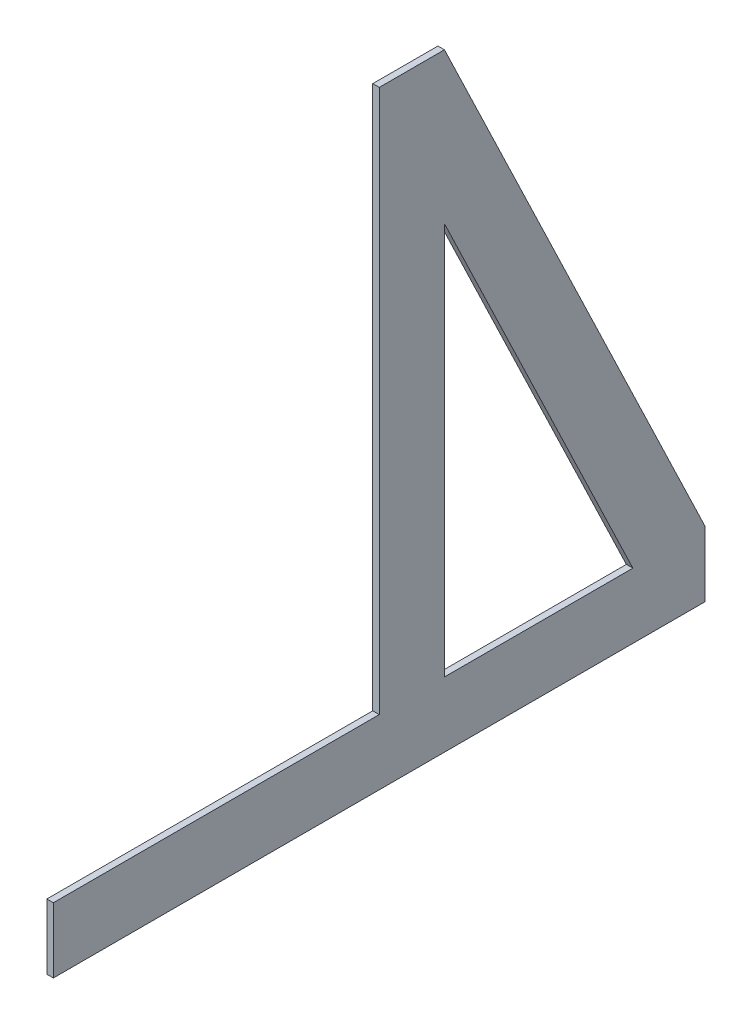
ISO-10303-21;
HEADER;
FILE_DESCRIPTION(('STEP AP214'),'2;1');
FILE_NAME('part.step','',(''),(''),'','','');
FILE_SCHEMA(('AUTOMOTIVE_DESIGN { 1 0 10303 214 1 1 1 1 }'));
ENDSEC;
DATA;
#1=APPLICATION_CONTEXT('core data for automotive mechanical design processes');
#2=APPLICATION_PROTOCOL_DEFINITION('international standard','automotive_design',2000,#1);
#3=PRODUCT_CONTEXT('',#1,'mechanical');
#4=PRODUCT('Part','Part','',(#3));
#5=PRODUCT_RELATED_PRODUCT_CATEGORY('part','',(#4));
#6=PRODUCT_DEFINITION_FORMATION('','',#4);
#7=PRODUCT_DEFINITION_CONTEXT('part definition',#1,'design');
#8=PRODUCT_DEFINITION('design','',#6,#7);
#9=PRODUCT_DEFINITION_SHAPE('','',#8);
#10=(LENGTH_UNIT() NAMED_UNIT(*) SI_UNIT(.MILLI.,.METRE.));
#11=(NAMED_UNIT(*) PLANE_ANGLE_UNIT() SI_UNIT($,.RADIAN.));
#12=(NAMED_UNIT(*) SI_UNIT($,.STERADIAN.) SOLID_ANGLE_UNIT());
#13=UNCERTAINTY_MEASURE_WITH_UNIT(LENGTH_MEASURE(1.E-05),#10,'distance_accuracy_value','');
#14=(GEOMETRIC_REPRESENTATION_CONTEXT(3) GLOBAL_UNCERTAINTY_ASSIGNED_CONTEXT((#13)) GLOBAL_UNIT_ASSIGNED_CONTEXT((#10,
#11,#12)) REPRESENTATION_CONTEXT('',''));
#15=CARTESIAN_POINT('',(0.,0.,0.));
#16=DIRECTION('',(0.,0.,1.));
#17=DIRECTION('',(1.,0.,0.));
#18=AXIS2_PLACEMENT_3D('',#15,#16,#17);
#19=CARTESIAN_POINT('',(6.,0.,0.));
#20=DIRECTION('',(1.,0.,0.));
#21=DIRECTION('',(0.,0.,-1.));
#22=AXIS2_PLACEMENT_3D('',#19,#20,#21);
#23=PLANE('',#22);
#24=DIRECTION('',(0.,-1.,0.));
#25=VECTOR('',#24,1.);
#26=CARTESIAN_POINT('',(6.,-164.461538461539,593.846153846154));
#27=LINE('',#26,#25);
#28=CARTESIAN_POINT('',(6.,-164.461538461539,593.846153846154));
#29=VERTEX_POINT('',#28);
#30=CARTESIAN_POINT('',(6.,-224.461538461539,593.846153846154));
#31=VERTEX_POINT('',#30);
#32=EDGE_CURVE('E153',#29,#31,#27,.T.);
#33=ORIENTED_EDGE('',*,*,#32,.T.);
#34=DIRECTION('',(0.,0.,-1.));
#35=VECTOR('',#34,1.);
#36=CARTESIAN_POINT('',(6.,-224.461538461539,593.846153846154));
#37=LINE('',#36,#35);
#38=CARTESIAN_POINT('',(6.,-224.461538461539,-6.15384615384608));
#39=VERTEX_POINT('',#38);
#40=EDGE_CURVE('E157',#31,#39,#37,.T.);
#41=ORIENTED_EDGE('',*,*,#40,.T.);
#42=DIRECTION('',(0.,1.,0.));
#43=VECTOR('',#42,1.);
#44=CARTESIAN_POINT('',(6.,-224.461538461539,-6.15384615384608));
#45=LINE('',#44,#43);
#46=CARTESIAN_POINT('',(6.,-164.461538461539,-6.15384615384608));
#47=VERTEX_POINT('',#46);
#48=EDGE_CURVE('E161',#39,#47,#45,.T.);
#49=ORIENTED_EDGE('',*,*,#48,.T.);
#50=DIRECTION('',(0.,0.901523057468273,0.432731067584771));
#51=VECTOR('',#50,1.);
#52=CARTESIAN_POINT('',(6.,-164.461538461539,-6.15384615384608));
#53=LINE('',#52,#51);
#54=CARTESIAN_POINT('',(6.,335.538461538461,233.846153846154));
#55=VERTEX_POINT('',#54);
#56=EDGE_CURVE('E164',#47,#55,#53,.T.);
#57=ORIENTED_EDGE('',*,*,#56,.T.);
#58=DIRECTION('',(0.,0.,1.));
#59=VECTOR('',#58,1.);
#60=CARTESIAN_POINT('',(6.,335.538461538461,233.846153846154));
#61=LINE('',#60,#59);
#62=CARTESIAN_POINT('',(6.,335.538461538461,293.846153846154));
#63=VERTEX_POINT('',#62);
#64=EDGE_CURVE('E167',#55,#63,#61,.T.);
#65=ORIENTED_EDGE('',*,*,#64,.T.);
#66=DIRECTION('',(0.,-1.,0.));
#67=VECTOR('',#66,1.);
#68=CARTESIAN_POINT('',(6.,335.538461538461,293.846153846154));
#69=LINE('',#68,#67);
#70=CARTESIAN_POINT('',(6.,-164.461538461539,293.846153846154));
#71=VERTEX_POINT('',#70);
#72=EDGE_CURVE('E170',#63,#71,#69,.T.);
#73=ORIENTED_EDGE('',*,*,#72,.T.);
#74=DIRECTION('',(0.,0.,1.));
#75=VECTOR('',#74,1.);
#76=CARTESIAN_POINT('',(6.,-164.461538461539,293.846153846154));
#77=LINE('',#76,#75);
#78=EDGE_CURVE('E173',#71,#29,#77,.T.);
#79=ORIENTED_EDGE('',*,*,#78,.T.);
#80=EDGE_LOOP('',(#33,#41,#49,#57,#65,#73,#79));
#81=FACE_BOUND('',#80,.T.);
#82=DIRECTION('',(0.,0.,-1.));
#83=VECTOR('',#82,1.);
#84=CARTESIAN_POINT('',(6.,-164.461538461539,233.846153846154));
#85=LINE('',#84,#83);
#86=CARTESIAN_POINT('',(6.,-164.461538461539,233.846153846154));
#87=VERTEX_POINT('',#86);
#88=CARTESIAN_POINT('',(6.,-164.461538461539,60.4001920406917));
#89=VERTEX_POINT('',#88);
#90=EDGE_CURVE('E126',#87,#89,#85,.T.);
#91=ORIENTED_EDGE('',*,*,#90,.F.);
#92=DIRECTION('',(0.,-1.,0.));
#93=VECTOR('',#92,1.);
#94=CARTESIAN_POINT('',(6.,196.884215299841,233.846153846154));
#95=LINE('',#94,#93);
#96=CARTESIAN_POINT('',(6.,196.884215299841,233.846153846154));
#97=VERTEX_POINT('',#96);
#98=EDGE_CURVE('E117',#97,#87,#95,.T.);
#99=ORIENTED_EDGE('',*,*,#98,.F.);
#100=DIRECTION('',(0.,0.901523057468274,0.432731067584771));
#101=VECTOR('',#100,1.);
#102=CARTESIAN_POINT('',(6.,-164.461538461539,60.4001920406917));
#103=LINE('',#102,#101);
#104=EDGE_CURVE('E136',#89,#97,#103,.T.);
#105=ORIENTED_EDGE('',*,*,#104,.F.);
#106=EDGE_LOOP('',(#91,#99,#105));
#107=FACE_BOUND('',#106,.T.);
#108=ADVANCED_FACE('F39',(#81,#107),#23,.T.);
#109=CARTESIAN_POINT('',(0.,0.,0.));
#110=DIRECTION('',(1.,0.,0.));
#111=DIRECTION('',(0.,0.,-1.));
#112=AXIS2_PLACEMENT_3D('',#109,#110,#111);
#113=PLANE('',#112);
#114=DIRECTION('',(0.,-1.,0.));
#115=VECTOR('',#114,1.);
#116=CARTESIAN_POINT('',(0.,-164.461538461539,593.846153846154));
#117=LINE('',#116,#115);
#118=CARTESIAN_POINT('',(0.,-164.461538461539,593.846153846154));
#119=VERTEX_POINT('',#118);
#120=CARTESIAN_POINT('',(0.,-224.461538461539,593.846153846154));
#121=VERTEX_POINT('',#120);
#122=EDGE_CURVE('E134',#119,#121,#117,.T.);
#123=ORIENTED_EDGE('',*,*,#122,.F.);
#124=DIRECTION('',(0.,0.,1.));
#125=VECTOR('',#124,1.);
#126=CARTESIAN_POINT('',(0.,-164.461538461539,293.846153846154));
#127=LINE('',#126,#125);
#128=CARTESIAN_POINT('',(0.,-164.461538461539,293.846153846154));
#129=VERTEX_POINT('',#128);
#130=EDGE_CURVE('E158',#129,#119,#127,.T.);
#131=ORIENTED_EDGE('',*,*,#130,.F.);
#132=DIRECTION('',(0.,-1.,0.));
#133=VECTOR('',#132,1.);
#134=CARTESIAN_POINT('',(0.,335.538461538461,293.846153846154));
#135=LINE('',#134,#133);
#136=CARTESIAN_POINT('',(0.,335.538461538461,293.846153846154));
#137=VERTEX_POINT('',#136);
#138=EDGE_CURVE('E192',#137,#129,#135,.T.);
#139=ORIENTED_EDGE('',*,*,#138,.F.);
#140=DIRECTION('',(0.,0.,1.));
#141=VECTOR('',#140,1.);
#142=CARTESIAN_POINT('',(0.,335.538461538461,233.846153846154));
#143=LINE('',#142,#141);
#144=CARTESIAN_POINT('',(0.,335.538461538461,233.846153846154));
#145=VERTEX_POINT('',#144);
#146=EDGE_CURVE('E189',#145,#137,#143,.T.);
#147=ORIENTED_EDGE('',*,*,#146,.F.);
#148=DIRECTION('',(0.,0.901523057468273,0.432731067584771));
#149=VECTOR('',#148,1.);
#150=CARTESIAN_POINT('',(0.,-164.461538461539,-6.15384615384608));
#151=LINE('',#150,#149);
#152=CARTESIAN_POINT('',(0.,-164.461538461539,-6.15384615384608));
#153=VERTEX_POINT('',#152);
#154=EDGE_CURVE('E186',#153,#145,#151,.T.);
#155=ORIENTED_EDGE('',*,*,#154,.F.);
#156=DIRECTION('',(0.,1.,0.));
#157=VECTOR('',#156,1.);
#158=CARTESIAN_POINT('',(0.,-224.461538461539,-6.15384615384608));
#159=LINE('',#158,#157);
#160=CARTESIAN_POINT('',(0.,-224.461538461539,-6.15384615384608));
#161=VERTEX_POINT('',#160);
#162=EDGE_CURVE('E183',#161,#153,#159,.T.);
#163=ORIENTED_EDGE('',*,*,#162,.F.);
#164=DIRECTION('',(0.,0.,-1.));
#165=VECTOR('',#164,1.);
#166=CARTESIAN_POINT('',(0.,-224.461538461539,593.846153846154));
#167=LINE('',#166,#165);
#168=EDGE_CURVE('E180',#121,#161,#167,.T.);
#169=ORIENTED_EDGE('',*,*,#168,.F.);
#170=EDGE_LOOP('',(#123,#131,#139,#147,#155,#163,#169));
#171=FACE_BOUND('',#170,.T.);
#172=DIRECTION('',(0.,-1.,0.));
#173=VECTOR('',#172,1.);
#174=CARTESIAN_POINT('',(0.,196.884215299841,233.846153846154));
#175=LINE('',#174,#173);
#176=CARTESIAN_POINT('',(0.,196.884215299841,233.846153846154));
#177=VERTEX_POINT('',#176);
#178=CARTESIAN_POINT('',(0.,-164.461538461539,233.846153846154));
#179=VERTEX_POINT('',#178);
#180=EDGE_CURVE('E63',#177,#179,#175,.T.);
#181=ORIENTED_EDGE('',*,*,#180,.T.);
#182=DIRECTION('',(0.,0.,-1.));
#183=VECTOR('',#182,1.);
#184=CARTESIAN_POINT('',(0.,-164.461538461539,233.846153846154));
#185=LINE('',#184,#183);
#186=CARTESIAN_POINT('',(0.,-164.461538461539,60.4001920406917));
#187=VERTEX_POINT('',#186);
#188=EDGE_CURVE('E132',#179,#187,#185,.T.);
#189=ORIENTED_EDGE('',*,*,#188,.T.);
#190=DIRECTION('',(0.,0.901523057468274,0.432731067584771));
#191=VECTOR('',#190,1.);
#192=CARTESIAN_POINT('',(0.,-164.461538461539,60.4001920406917));
#193=LINE('',#192,#191);
#194=EDGE_CURVE('E127',#187,#177,#193,.T.);
#195=ORIENTED_EDGE('',*,*,#194,.T.);
#196=EDGE_LOOP('',(#181,#189,#195));
#197=FACE_BOUND('',#196,.T.);
#198=ADVANCED_FACE('F227',(#171,#197),#113,.F.);
#199=CARTESIAN_POINT('',(6.,-164.461538461539,593.846153846154));
#200=DIRECTION('',(0.,0.,-1.));
#201=DIRECTION('',(-1.,0.,0.));
#202=AXIS2_PLACEMENT_3D('',#199,#200,#201);
#203=PLANE('',#202);
#204=ORIENTED_EDGE('',*,*,#122,.T.);
#205=DIRECTION('',(-1.,0.,0.));
#206=VECTOR('',#205,1.);
#207=CARTESIAN_POINT('',(6.,-224.461538461539,593.846153846154));
#208=LINE('',#207,#206);
#209=EDGE_CURVE('E11',#31,#121,#208,.T.);
#210=ORIENTED_EDGE('',*,*,#209,.F.);
#211=ORIENTED_EDGE('',*,*,#32,.F.);
#212=DIRECTION('',(-1.,0.,0.));
#213=VECTOR('',#212,1.);
#214=CARTESIAN_POINT('',(6.,-164.461538461539,593.846153846154));
#215=LINE('',#214,#213);
#216=EDGE_CURVE('E176',#29,#119,#215,.T.);
#217=ORIENTED_EDGE('',*,*,#216,.T.);
#218=EDGE_LOOP('',(#204,#210,#211,#217));
#219=FACE_BOUND('',#218,.T.);
#220=ADVANCED_FACE('F41',(#219),#203,.F.);
#221=CARTESIAN_POINT('',(6.,-224.461538461539,593.846153846154));
#222=DIRECTION('',(0.,1.,0.));
#223=DIRECTION('',(0.,0.,1.));
#224=AXIS2_PLACEMENT_3D('',#221,#222,#223);
#225=PLANE('',#224);
#226=ORIENTED_EDGE('',*,*,#168,.T.);
#227=DIRECTION('',(-1.,0.,0.));
#228=VECTOR('',#227,1.);
#229=CARTESIAN_POINT('',(6.,-224.461538461539,-6.15384615384608));
#230=LINE('',#229,#228);
#231=EDGE_CURVE('E48',#39,#161,#230,.T.);
#232=ORIENTED_EDGE('',*,*,#231,.F.);
#233=ORIENTED_EDGE('',*,*,#40,.F.);
#234=ORIENTED_EDGE('',*,*,#209,.T.);
#235=EDGE_LOOP('',(#226,#232,#233,#234));
#236=FACE_BOUND('',#235,.T.);
#237=ADVANCED_FACE('F244',(#236),#225,.F.);
#238=CARTESIAN_POINT('',(6.,-224.461538461539,-6.15384615384608));
#239=DIRECTION('',(0.,0.,1.));
#240=DIRECTION('',(1.,0.,0.));
#241=AXIS2_PLACEMENT_3D('',#238,#239,#240);
#242=PLANE('',#241);
#243=ORIENTED_EDGE('',*,*,#162,.T.);
#244=DIRECTION('',(-1.,0.,0.));
#245=VECTOR('',#244,1.);
#246=CARTESIAN_POINT('',(6.,-164.461538461539,-6.15384615384608));
#247=LINE('',#246,#245);
#248=EDGE_CURVE('E212',#47,#153,#247,.T.);
#249=ORIENTED_EDGE('',*,*,#248,.F.);
#250=ORIENTED_EDGE('',*,*,#48,.F.);
#251=ORIENTED_EDGE('',*,*,#231,.T.);
#252=EDGE_LOOP('',(#243,#249,#250,#251));
#253=FACE_BOUND('',#252,.T.);
#254=ADVANCED_FACE('F221',(#253),#242,.F.);
#255=CARTESIAN_POINT('',(6.,-164.461538461539,-6.15384615384608));
#256=DIRECTION('',(0.,-0.432731067584771,0.901523057468274));
#257=DIRECTION('',(0.,-0.901523057468274,-0.432731067584771));
#258=AXIS2_PLACEMENT_3D('',#255,#256,#257);
#259=PLANE('',#258);
#260=ORIENTED_EDGE('',*,*,#154,.T.);
#261=DIRECTION('',(-1.,0.,0.));
#262=VECTOR('',#261,1.);
#263=CARTESIAN_POINT('',(6.,335.538461538461,233.846153846154));
#264=LINE('',#263,#262);
#265=EDGE_CURVE('E208',#55,#145,#264,.T.);
#266=ORIENTED_EDGE('',*,*,#265,.F.);
#267=ORIENTED_EDGE('',*,*,#56,.F.);
#268=ORIENTED_EDGE('',*,*,#248,.T.);
#269=EDGE_LOOP('',(#260,#266,#267,#268));
#270=FACE_BOUND('',#269,.T.);
#271=ADVANCED_FACE('F233',(#270),#259,.F.);
#272=CARTESIAN_POINT('',(6.,335.538461538461,233.846153846154));
#273=DIRECTION('',(0.,-1.,0.));
#274=DIRECTION('',(0.,0.,-1.));
#275=AXIS2_PLACEMENT_3D('',#272,#273,#274);
#276=PLANE('',#275);
#277=ORIENTED_EDGE('',*,*,#146,.T.);
#278=DIRECTION('',(-1.,0.,0.));
#279=VECTOR('',#278,1.);
#280=CARTESIAN_POINT('',(6.,335.538461538461,293.846153846154));
#281=LINE('',#280,#279);
#282=EDGE_CURVE('E204',#63,#137,#281,.T.);
#283=ORIENTED_EDGE('',*,*,#282,.F.);
#284=ORIENTED_EDGE('',*,*,#64,.F.);
#285=ORIENTED_EDGE('',*,*,#265,.T.);
#286=EDGE_LOOP('',(#277,#283,#284,#285));
#287=FACE_BOUND('',#286,.T.);
#288=ADVANCED_FACE('F237',(#287),#276,.F.);
#289=CARTESIAN_POINT('',(6.,335.538461538461,293.846153846154));
#290=DIRECTION('',(0.,0.,-1.));
#291=DIRECTION('',(0.,1.,0.));
#292=AXIS2_PLACEMENT_3D('',#289,#290,#291);
#293=PLANE('',#292);
#294=ORIENTED_EDGE('',*,*,#138,.T.);
#295=DIRECTION('',(-1.,0.,0.));
#296=VECTOR('',#295,1.);
#297=CARTESIAN_POINT('',(6.,-164.461538461539,293.846153846154));
#298=LINE('',#297,#296);
#299=EDGE_CURVE('E200',#71,#129,#298,.T.);
#300=ORIENTED_EDGE('',*,*,#299,.F.);
#301=ORIENTED_EDGE('',*,*,#72,.F.);
#302=ORIENTED_EDGE('',*,*,#282,.T.);
#303=EDGE_LOOP('',(#294,#300,#301,#302));
#304=FACE_BOUND('',#303,.T.);
#305=ADVANCED_FACE('F252',(#304),#293,.F.);
#306=CARTESIAN_POINT('',(6.,-164.461538461539,293.846153846154));
#307=DIRECTION('',(0.,-1.,0.));
#308=DIRECTION('',(0.,0.,-1.));
#309=AXIS2_PLACEMENT_3D('',#306,#307,#308);
#310=PLANE('',#309);
#311=ORIENTED_EDGE('',*,*,#130,.T.);
#312=ORIENTED_EDGE('',*,*,#216,.F.);
#313=ORIENTED_EDGE('',*,*,#78,.F.);
#314=ORIENTED_EDGE('',*,*,#299,.T.);
#315=EDGE_LOOP('',(#311,#312,#313,#314));
#316=FACE_BOUND('',#315,.T.);
#317=ADVANCED_FACE('F249',(#316),#310,.F.);
#318=CARTESIAN_POINT('',(6.,196.884215299841,233.846153846154));
#319=DIRECTION('',(0.,0.,-1.));
#320=DIRECTION('',(-1.,0.,0.));
#321=AXIS2_PLACEMENT_3D('',#318,#319,#320);
#322=PLANE('',#321);
#323=ORIENTED_EDGE('',*,*,#180,.F.);
#324=DIRECTION('',(-1.,0.,0.));
#325=VECTOR('',#324,1.);
#326=CARTESIAN_POINT('',(6.,196.884215299841,233.846153846154));
#327=LINE('',#326,#325);
#328=EDGE_CURVE('E121',#97,#177,#327,.T.);
#329=ORIENTED_EDGE('',*,*,#328,.F.);
#330=ORIENTED_EDGE('',*,*,#98,.T.);
#331=DIRECTION('',(-1.,0.,0.));
#332=VECTOR('',#331,1.);
#333=CARTESIAN_POINT('',(6.,-164.461538461539,233.846153846154));
#334=LINE('',#333,#332);
#335=EDGE_CURVE('E120',#87,#179,#334,.T.);
#336=ORIENTED_EDGE('',*,*,#335,.T.);
#337=EDGE_LOOP('',(#323,#329,#330,#336));
#338=FACE_BOUND('',#337,.T.);
#339=ADVANCED_FACE('F119',(#338),#322,.T.);
#340=CARTESIAN_POINT('',(6.,-164.461538461539,233.846153846154));
#341=DIRECTION('',(0.,1.,0.));
#342=DIRECTION('',(0.,0.,1.));
#343=AXIS2_PLACEMENT_3D('',#340,#341,#342);
#344=PLANE('',#343);
#345=ORIENTED_EDGE('',*,*,#188,.F.);
#346=ORIENTED_EDGE('',*,*,#335,.F.);
#347=ORIENTED_EDGE('',*,*,#90,.T.);
#348=DIRECTION('',(-1.,0.,0.));
#349=VECTOR('',#348,1.);
#350=CARTESIAN_POINT('',(6.,-164.461538461539,60.4001920406917));
#351=LINE('',#350,#349);
#352=EDGE_CURVE('E55',#89,#187,#351,.T.);
#353=ORIENTED_EDGE('',*,*,#352,.T.);
#354=EDGE_LOOP('',(#345,#346,#347,#353));
#355=FACE_BOUND('',#354,.T.);
#356=ADVANCED_FACE('F130',(#355),#344,.T.);
#357=CARTESIAN_POINT('',(6.,-164.461538461539,60.4001920406917));
#358=DIRECTION('',(0.,-0.432731067584771,0.901523057468274));
#359=DIRECTION('',(0.,-0.901523057468274,-0.432731067584771));
#360=AXIS2_PLACEMENT_3D('',#357,#358,#359);
#361=PLANE('',#360);
#362=ORIENTED_EDGE('',*,*,#194,.F.);
#363=ORIENTED_EDGE('',*,*,#352,.F.);
#364=ORIENTED_EDGE('',*,*,#104,.T.);
#365=ORIENTED_EDGE('',*,*,#328,.T.);
#366=EDGE_LOOP('',(#362,#363,#364,#365));
#367=FACE_BOUND('',#366,.T.);
#368=ADVANCED_FACE('F272',(#367),#361,.T.);
#369=CLOSED_SHELL('',(#108,#198,#220,#237,#254,#271,#288,#305,#317,#339,#356,#368));
#370=MANIFOLD_SOLID_BREP('B2',#369);
#371=ADVANCED_BREP_SHAPE_REPRESENTATION('',(#18,#370),#14);
#372=SHAPE_DEFINITION_REPRESENTATION(#9,#371);
ENDSEC;
END-ISO-10303-21;
